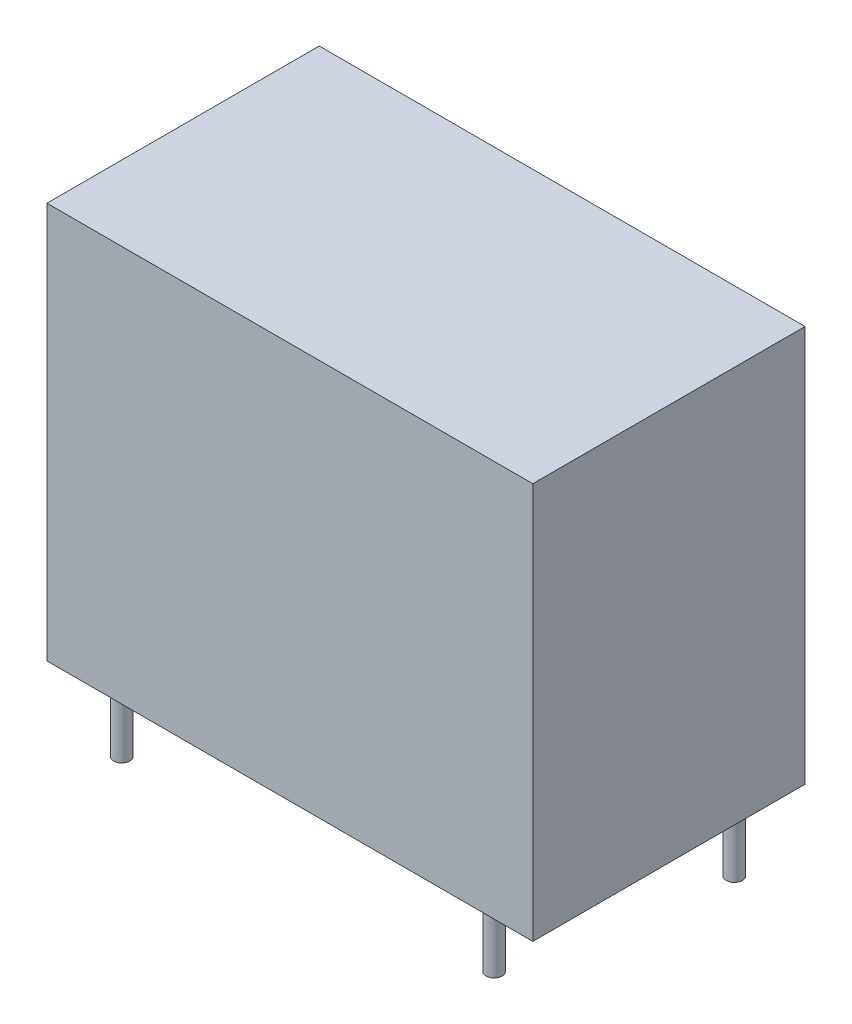
ISO-10303-21;
HEADER;
FILE_DESCRIPTION(('STEP AP214'),'2;1');
FILE_NAME('part.step','',(''),(''),'','','');
FILE_SCHEMA(('AUTOMOTIVE_DESIGN { 1 0 10303 214 1 1 1 1 }'));
ENDSEC;
DATA;
#1=APPLICATION_CONTEXT('core data for automotive mechanical design processes');
#2=APPLICATION_PROTOCOL_DEFINITION('international standard','automotive_design',2000,#1);
#3=PRODUCT_CONTEXT('',#1,'mechanical');
#4=PRODUCT('Part','Part','',(#3));
#5=PRODUCT_RELATED_PRODUCT_CATEGORY('part','',(#4));
#6=PRODUCT_DEFINITION_FORMATION('','',#4);
#7=PRODUCT_DEFINITION_CONTEXT('part definition',#1,'design');
#8=PRODUCT_DEFINITION('design','',#6,#7);
#9=PRODUCT_DEFINITION_SHAPE('','',#8);
#10=(LENGTH_UNIT() NAMED_UNIT(*) SI_UNIT(.MILLI.,.METRE.));
#11=(NAMED_UNIT(*) PLANE_ANGLE_UNIT() SI_UNIT($,.RADIAN.));
#12=(NAMED_UNIT(*) SI_UNIT($,.STERADIAN.) SOLID_ANGLE_UNIT());
#13=UNCERTAINTY_MEASURE_WITH_UNIT(LENGTH_MEASURE(1.E-05),#10,'distance_accuracy_value','');
#14=(GEOMETRIC_REPRESENTATION_CONTEXT(3) GLOBAL_UNCERTAINTY_ASSIGNED_CONTEXT((#13)) GLOBAL_UNIT_ASSIGNED_CONTEXT((#10,
#11,#12)) REPRESENTATION_CONTEXT('',''));
#15=CARTESIAN_POINT('',(0.,0.,0.));
#16=DIRECTION('',(0.,0.,1.));
#17=DIRECTION('',(1.,0.,0.));
#18=AXIS2_PLACEMENT_3D('',#15,#16,#17);
#19=CARTESIAN_POINT('',(-9.1,14.85,-5.1));
#20=DIRECTION('',(1.,0.,0.));
#21=DIRECTION('',(0.,0.,-1.));
#22=AXIS2_PLACEMENT_3D('',#19,#20,#21);
#23=PLANE('',#22);
#24=DIRECTION('',(0.,0.,1.));
#25=VECTOR('',#24,1.);
#26=CARTESIAN_POINT('',(-9.1,0.,-5.1));
#27=LINE('',#26,#25);
#28=CARTESIAN_POINT('',(-9.1,0.,-5.1));
#29=VERTEX_POINT('',#28);
#30=CARTESIAN_POINT('',(-9.1,0.,5.1));
#31=VERTEX_POINT('',#30);
#32=EDGE_CURVE('E102',#29,#31,#27,.T.);
#33=ORIENTED_EDGE('',*,*,#32,.T.);
#34=DIRECTION('',(0.,-1.,0.));
#35=VECTOR('',#34,1.);
#36=CARTESIAN_POINT('',(-9.1,14.85,5.1));
#37=LINE('',#36,#35);
#38=CARTESIAN_POINT('',(-9.1,14.85,5.1));
#39=VERTEX_POINT('',#38);
#40=EDGE_CURVE('E93',#39,#31,#37,.T.);
#41=ORIENTED_EDGE('',*,*,#40,.F.);
#42=DIRECTION('',(0.,0.,1.));
#43=VECTOR('',#42,1.);
#44=CARTESIAN_POINT('',(-9.1,14.85,-5.1));
#45=LINE('',#44,#43);
#46=CARTESIAN_POINT('',(-9.1,14.85,-5.1));
#47=VERTEX_POINT('',#46);
#48=EDGE_CURVE('E87',#47,#39,#45,.T.);
#49=ORIENTED_EDGE('',*,*,#48,.F.);
#50=DIRECTION('',(0.,-1.,0.));
#51=VECTOR('',#50,1.);
#52=CARTESIAN_POINT('',(-9.1,14.85,-5.1));
#53=LINE('',#52,#51);
#54=EDGE_CURVE('E98',#47,#29,#53,.T.);
#55=ORIENTED_EDGE('',*,*,#54,.T.);
#56=EDGE_LOOP('',(#33,#41,#49,#55));
#57=FACE_BOUND('',#56,.T.);
#58=ADVANCED_FACE('F35',(#57),#23,.F.);
#59=CARTESIAN_POINT('',(-9.1,14.85,5.1));
#60=DIRECTION('',(0.,0.,-1.));
#61=DIRECTION('',(-1.,0.,0.));
#62=AXIS2_PLACEMENT_3D('',#59,#60,#61);
#63=PLANE('',#62);
#64=DIRECTION('',(1.,0.,0.));
#65=VECTOR('',#64,1.);
#66=CARTESIAN_POINT('',(-9.1,0.,5.1));
#67=LINE('',#66,#65);
#68=CARTESIAN_POINT('',(9.1,0.,5.1));
#69=VERTEX_POINT('',#68);
#70=EDGE_CURVE('E92',#31,#69,#67,.T.);
#71=ORIENTED_EDGE('',*,*,#70,.T.);
#72=DIRECTION('',(0.,-1.,0.));
#73=VECTOR('',#72,1.);
#74=CARTESIAN_POINT('',(9.1,14.85,5.1));
#75=LINE('',#74,#73);
#76=CARTESIAN_POINT('',(9.1,14.85,5.1));
#77=VERTEX_POINT('',#76);
#78=EDGE_CURVE('E90',#77,#69,#75,.T.);
#79=ORIENTED_EDGE('',*,*,#78,.F.);
#80=DIRECTION('',(1.,0.,0.));
#81=VECTOR('',#80,1.);
#82=CARTESIAN_POINT('',(-9.1,14.85,5.1));
#83=LINE('',#82,#81);
#84=EDGE_CURVE('E82',#39,#77,#83,.T.);
#85=ORIENTED_EDGE('',*,*,#84,.F.);
#86=ORIENTED_EDGE('',*,*,#40,.T.);
#87=EDGE_LOOP('',(#71,#79,#85,#86));
#88=FACE_BOUND('',#87,.T.);
#89=ADVANCED_FACE('F91',(#88),#63,.F.);
#90=CARTESIAN_POINT('',(9.1,14.85,-5.1));
#91=DIRECTION('',(-1.,0.,0.));
#92=DIRECTION('',(0.,0.,1.));
#93=AXIS2_PLACEMENT_3D('',#90,#91,#92);
#94=PLANE('',#93);
#95=DIRECTION('',(0.,0.,-1.));
#96=VECTOR('',#95,1.);
#97=CARTESIAN_POINT('',(9.1,0.,-5.1));
#98=LINE('',#97,#96);
#99=CARTESIAN_POINT('',(9.1,0.,-5.1));
#100=VERTEX_POINT('',#99);
#101=EDGE_CURVE('E68',#69,#100,#98,.T.);
#102=ORIENTED_EDGE('',*,*,#101,.T.);
#103=DIRECTION('',(0.,-1.,0.));
#104=VECTOR('',#103,1.);
#105=CARTESIAN_POINT('',(9.1,14.85,-5.1));
#106=LINE('',#105,#104);
#107=CARTESIAN_POINT('',(9.1,14.85,-5.1));
#108=VERTEX_POINT('',#107);
#109=EDGE_CURVE('E94',#108,#100,#106,.T.);
#110=ORIENTED_EDGE('',*,*,#109,.F.);
#111=DIRECTION('',(0.,0.,-1.));
#112=VECTOR('',#111,1.);
#113=CARTESIAN_POINT('',(9.1,14.85,-5.1));
#114=LINE('',#113,#112);
#115=EDGE_CURVE('E85',#77,#108,#114,.T.);
#116=ORIENTED_EDGE('',*,*,#115,.F.);
#117=ORIENTED_EDGE('',*,*,#78,.T.);
#118=EDGE_LOOP('',(#102,#110,#116,#117));
#119=FACE_BOUND('',#118,.T.);
#120=ADVANCED_FACE('F96',(#119),#94,.F.);
#121=CARTESIAN_POINT('',(-9.1,14.85,-5.1));
#122=DIRECTION('',(0.,0.,1.));
#123=DIRECTION('',(1.,0.,0.));
#124=AXIS2_PLACEMENT_3D('',#121,#122,#123);
#125=PLANE('',#124);
#126=DIRECTION('',(-1.,0.,0.));
#127=VECTOR('',#126,1.);
#128=CARTESIAN_POINT('',(-9.1,0.,-5.1));
#129=LINE('',#128,#127);
#130=EDGE_CURVE('E74',#100,#29,#129,.T.);
#131=ORIENTED_EDGE('',*,*,#130,.T.);
#132=ORIENTED_EDGE('',*,*,#54,.F.);
#133=DIRECTION('',(-1.,0.,0.));
#134=VECTOR('',#133,1.);
#135=CARTESIAN_POINT('',(-9.1,14.85,-5.1));
#136=LINE('',#135,#134);
#137=EDGE_CURVE('E51',#108,#47,#136,.T.);
#138=ORIENTED_EDGE('',*,*,#137,.F.);
#139=ORIENTED_EDGE('',*,*,#109,.T.);
#140=EDGE_LOOP('',(#131,#132,#138,#139));
#141=FACE_BOUND('',#140,.T.);
#142=ADVANCED_FACE('F139',(#141),#125,.F.);
#143=CARTESIAN_POINT('',(0.,14.85,0.));
#144=DIRECTION('',(0.,1.,0.));
#145=DIRECTION('',(0.,0.,1.));
#146=AXIS2_PLACEMENT_3D('',#143,#144,#145);
#147=PLANE('',#146);
#148=ORIENTED_EDGE('',*,*,#48,.T.);
#149=ORIENTED_EDGE('',*,*,#84,.T.);
#150=ORIENTED_EDGE('',*,*,#115,.T.);
#151=ORIENTED_EDGE('',*,*,#137,.T.);
#152=EDGE_LOOP('',(#148,#149,#150,#151));
#153=FACE_BOUND('',#152,.T.);
#154=ADVANCED_FACE('F83',(#153),#147,.T.);
#155=CARTESIAN_POINT('',(0.,0.,0.));
#156=DIRECTION('',(0.,1.,0.));
#157=DIRECTION('',(0.,0.,1.));
#158=AXIS2_PLACEMENT_3D('',#155,#156,#157);
#159=PLANE('',#158);
#160=CARTESIAN_POINT('',(7.75,0.,-3.8));
#161=DIRECTION('',(0.,1.,0.));
#162=DIRECTION('',(0.,0.,1.));
#163=AXIS2_PLACEMENT_3D('',#160,#161,#162);
#164=CIRCLE('',#163,0.3);
#165=CARTESIAN_POINT('',(7.75,0.,-3.5));
#166=VERTEX_POINT('',#165);
#167=EDGE_CURVE('E11',#166,#166,#164,.F.);
#168=ORIENTED_EDGE('',*,*,#167,.F.);
#169=EDGE_LOOP('',(#168));
#170=FACE_BOUND('',#169,.T.);
#171=CARTESIAN_POINT('',(4.95,0.,-3.8));
#172=DIRECTION('',(0.,1.,0.));
#173=DIRECTION('',(0.,0.,1.));
#174=AXIS2_PLACEMENT_3D('',#171,#172,#173);
#175=CIRCLE('',#174,0.3);
#176=CARTESIAN_POINT('',(4.95,0.,-3.5));
#177=VERTEX_POINT('',#176);
#178=EDGE_CURVE('E43',#177,#177,#175,.F.);
#179=ORIENTED_EDGE('',*,*,#178,.F.);
#180=EDGE_LOOP('',(#179));
#181=FACE_BOUND('',#180,.T.);
#182=CARTESIAN_POINT('',(6.35,0.,3.8));
#183=DIRECTION('',(0.,1.,0.));
#184=DIRECTION('',(0.,0.,1.));
#185=AXIS2_PLACEMENT_3D('',#182,#183,#184);
#186=CIRCLE('',#185,0.3);
#187=CARTESIAN_POINT('',(6.35,0.,4.1));
#188=VERTEX_POINT('',#187);
#189=EDGE_CURVE('E118',#188,#188,#186,.F.);
#190=ORIENTED_EDGE('',*,*,#189,.F.);
#191=EDGE_LOOP('',(#190));
#192=FACE_BOUND('',#191,.T.);
#193=CARTESIAN_POINT('',(-7.6,0.,-3.8));
#194=DIRECTION('',(0.,1.,0.));
#195=DIRECTION('',(0.,0.,1.));
#196=AXIS2_PLACEMENT_3D('',#193,#194,#195);
#197=CIRCLE('',#196,0.3);
#198=CARTESIAN_POINT('',(-7.6,0.,-3.5));
#199=VERTEX_POINT('',#198);
#200=EDGE_CURVE('E115',#199,#199,#197,.F.);
#201=ORIENTED_EDGE('',*,*,#200,.F.);
#202=EDGE_LOOP('',(#201));
#203=FACE_BOUND('',#202,.T.);
#204=CARTESIAN_POINT('',(-7.6,0.,3.8));
#205=DIRECTION('',(0.,1.,0.));
#206=DIRECTION('',(0.,0.,1.));
#207=AXIS2_PLACEMENT_3D('',#204,#205,#206);
#208=CIRCLE('',#207,0.3);
#209=CARTESIAN_POINT('',(-7.6,0.,4.1));
#210=VERTEX_POINT('',#209);
#211=EDGE_CURVE('E112',#210,#210,#208,.F.);
#212=ORIENTED_EDGE('',*,*,#211,.F.);
#213=EDGE_LOOP('',(#212));
#214=FACE_BOUND('',#213,.T.);
#215=ORIENTED_EDGE('',*,*,#32,.F.);
#216=ORIENTED_EDGE('',*,*,#130,.F.);
#217=ORIENTED_EDGE('',*,*,#101,.F.);
#218=ORIENTED_EDGE('',*,*,#70,.F.);
#219=EDGE_LOOP('',(#215,#216,#217,#218));
#220=FACE_BOUND('',#219,.T.);
#221=ADVANCED_FACE('F125',(#170,#181,#192,#203,#214,#220),#159,.F.);
#222=CARTESIAN_POINT('',(-7.6,-3.,3.8));
#223=DIRECTION('',(0.,1.,0.));
#224=DIRECTION('',(0.,0.,1.));
#225=AXIS2_PLACEMENT_3D('',#222,#223,#224);
#226=CYLINDRICAL_SURFACE('',#225,0.3);
#227=CARTESIAN_POINT('',(-7.6,-3.,3.8));
#228=DIRECTION('',(0.,-1.,0.));
#229=DIRECTION('',(0.,0.,-1.));
#230=AXIS2_PLACEMENT_3D('',#227,#228,#229);
#231=CIRCLE('',#230,0.3);
#232=CARTESIAN_POINT('',(-7.6,-3.,3.5));
#233=VERTEX_POINT('',#232);
#234=EDGE_CURVE('E105',#233,#233,#231,.T.);
#235=ORIENTED_EDGE('',*,*,#234,.F.);
#236=EDGE_LOOP('',(#235));
#237=FACE_BOUND('',#236,.T.);
#238=ORIENTED_EDGE('',*,*,#211,.T.);
#239=EDGE_LOOP('',(#238));
#240=FACE_BOUND('',#239,.T.);
#241=ADVANCED_FACE('F128',(#237,#240),#226,.T.);
#242=CARTESIAN_POINT('',(-7.6,-3.,3.8));
#243=DIRECTION('',(0.,-1.,0.));
#244=DIRECTION('',(0.,0.,-1.));
#245=AXIS2_PLACEMENT_3D('',#242,#243,#244);
#246=PLANE('',#245);
#247=ORIENTED_EDGE('',*,*,#234,.T.);
#248=EDGE_LOOP('',(#247));
#249=FACE_BOUND('',#248,.T.);
#250=ADVANCED_FACE('F183',(#249),#246,.T.);
#251=CARTESIAN_POINT('',(-7.6,-3.,-3.8));
#252=DIRECTION('',(0.,1.,0.));
#253=DIRECTION('',(0.,0.,1.));
#254=AXIS2_PLACEMENT_3D('',#251,#252,#253);
#255=CYLINDRICAL_SURFACE('',#254,0.3);
#256=CARTESIAN_POINT('',(-7.6,-3.,-3.8));
#257=DIRECTION('',(0.,-1.,0.));
#258=DIRECTION('',(0.,0.,-1.));
#259=AXIS2_PLACEMENT_3D('',#256,#257,#258);
#260=CIRCLE('',#259,0.3);
#261=CARTESIAN_POINT('',(-7.6,-3.,-4.1));
#262=VERTEX_POINT('',#261);
#263=EDGE_CURVE('E287',#262,#262,#260,.T.);
#264=ORIENTED_EDGE('',*,*,#263,.F.);
#265=EDGE_LOOP('',(#264));
#266=FACE_BOUND('',#265,.T.);
#267=ORIENTED_EDGE('',*,*,#200,.T.);
#268=EDGE_LOOP('',(#267));
#269=FACE_BOUND('',#268,.T.);
#270=ADVANCED_FACE('F193',(#266,#269),#255,.T.);
#271=CARTESIAN_POINT('',(-7.6,-3.,-3.8));
#272=DIRECTION('',(0.,-1.,0.));
#273=DIRECTION('',(0.,0.,-1.));
#274=AXIS2_PLACEMENT_3D('',#271,#272,#273);
#275=PLANE('',#274);
#276=ORIENTED_EDGE('',*,*,#263,.T.);
#277=EDGE_LOOP('',(#276));
#278=FACE_BOUND('',#277,.T.);
#279=ADVANCED_FACE('F203',(#278),#275,.T.);
#280=CARTESIAN_POINT('',(6.35,-3.,3.8));
#281=DIRECTION('',(0.,1.,0.));
#282=DIRECTION('',(0.,0.,1.));
#283=AXIS2_PLACEMENT_3D('',#280,#281,#282);
#284=CYLINDRICAL_SURFACE('',#283,0.3);
#285=CARTESIAN_POINT('',(6.35,-3.,3.8));
#286=DIRECTION('',(0.,-1.,0.));
#287=DIRECTION('',(0.,0.,-1.));
#288=AXIS2_PLACEMENT_3D('',#285,#286,#287);
#289=CIRCLE('',#288,0.3);
#290=CARTESIAN_POINT('',(6.35,-3.,3.5));
#291=VERTEX_POINT('',#290);
#292=EDGE_CURVE('E282',#291,#291,#289,.T.);
#293=ORIENTED_EDGE('',*,*,#292,.F.);
#294=EDGE_LOOP('',(#293));
#295=FACE_BOUND('',#294,.T.);
#296=ORIENTED_EDGE('',*,*,#189,.T.);
#297=EDGE_LOOP('',(#296));
#298=FACE_BOUND('',#297,.T.);
#299=ADVANCED_FACE('F213',(#295,#298),#284,.T.);
#300=CARTESIAN_POINT('',(6.35,-3.,3.8));
#301=DIRECTION('',(0.,-1.,0.));
#302=DIRECTION('',(0.,0.,-1.));
#303=AXIS2_PLACEMENT_3D('',#300,#301,#302);
#304=PLANE('',#303);
#305=ORIENTED_EDGE('',*,*,#292,.T.);
#306=EDGE_LOOP('',(#305));
#307=FACE_BOUND('',#306,.T.);
#308=ADVANCED_FACE('F223',(#307),#304,.T.);
#309=CARTESIAN_POINT('',(4.95,-3.,-3.8));
#310=DIRECTION('',(0.,1.,0.));
#311=DIRECTION('',(0.,0.,1.));
#312=AXIS2_PLACEMENT_3D('',#309,#310,#311);
#313=CYLINDRICAL_SURFACE('',#312,0.3);
#314=CARTESIAN_POINT('',(4.95,-3.,-3.8));
#315=DIRECTION('',(0.,-1.,0.));
#316=DIRECTION('',(0.,0.,-1.));
#317=AXIS2_PLACEMENT_3D('',#314,#315,#316);
#318=CIRCLE('',#317,0.3);
#319=CARTESIAN_POINT('',(4.95,-3.,-4.1));
#320=VERTEX_POINT('',#319);
#321=EDGE_CURVE('E279',#320,#320,#318,.T.);
#322=ORIENTED_EDGE('',*,*,#321,.F.);
#323=EDGE_LOOP('',(#322));
#324=FACE_BOUND('',#323,.T.);
#325=ORIENTED_EDGE('',*,*,#178,.T.);
#326=EDGE_LOOP('',(#325));
#327=FACE_BOUND('',#326,.T.);
#328=ADVANCED_FACE('F123',(#324,#327),#313,.T.);
#329=CARTESIAN_POINT('',(4.95,-3.,-3.8));
#330=DIRECTION('',(0.,-1.,0.));
#331=DIRECTION('',(0.,0.,-1.));
#332=AXIS2_PLACEMENT_3D('',#329,#330,#331);
#333=PLANE('',#332);
#334=ORIENTED_EDGE('',*,*,#321,.T.);
#335=EDGE_LOOP('',(#334));
#336=FACE_BOUND('',#335,.T.);
#337=ADVANCED_FACE('F242',(#336),#333,.T.);
#338=CARTESIAN_POINT('',(7.75,-3.,-3.8));
#339=DIRECTION('',(0.,1.,0.));
#340=DIRECTION('',(0.,0.,1.));
#341=AXIS2_PLACEMENT_3D('',#338,#339,#340);
#342=CYLINDRICAL_SURFACE('',#341,0.3);
#343=CARTESIAN_POINT('',(7.75,-3.,-3.8));
#344=DIRECTION('',(0.,-1.,0.));
#345=DIRECTION('',(0.,0.,-1.));
#346=AXIS2_PLACEMENT_3D('',#343,#344,#345);
#347=CIRCLE('',#346,0.3);
#348=CARTESIAN_POINT('',(7.75,-3.,-4.1));
#349=VERTEX_POINT('',#348);
#350=EDGE_CURVE('E278',#349,#349,#347,.T.);
#351=ORIENTED_EDGE('',*,*,#350,.F.);
#352=EDGE_LOOP('',(#351));
#353=FACE_BOUND('',#352,.T.);
#354=ORIENTED_EDGE('',*,*,#167,.T.);
#355=EDGE_LOOP('',(#354));
#356=FACE_BOUND('',#355,.T.);
#357=ADVANCED_FACE('F252',(#353,#356),#342,.T.);
#358=CARTESIAN_POINT('',(7.75,-3.,-3.8));
#359=DIRECTION('',(0.,-1.,0.));
#360=DIRECTION('',(0.,0.,-1.));
#361=AXIS2_PLACEMENT_3D('',#358,#359,#360);
#362=PLANE('',#361);
#363=ORIENTED_EDGE('',*,*,#350,.T.);
#364=EDGE_LOOP('',(#363));
#365=FACE_BOUND('',#364,.T.);
#366=ADVANCED_FACE('F262',(#365),#362,.T.);
#367=CLOSED_SHELL('',(#58,#89,#120,#142,#154,#221,#241,#250,#270,#279,#299,#308,#328,#337,#357,#366));
#368=MANIFOLD_SOLID_BREP('B2',#367);
#369=ADVANCED_BREP_SHAPE_REPRESENTATION('',(#18,#368),#14);
#370=SHAPE_DEFINITION_REPRESENTATION(#9,#369);
ENDSEC;
END-ISO-10303-21;
